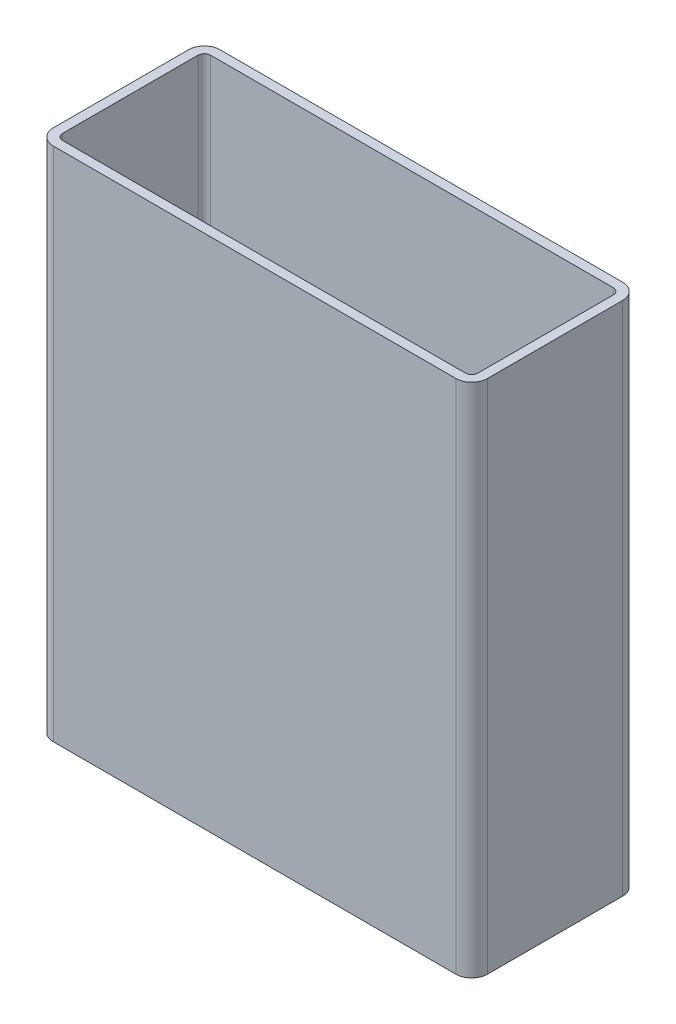
ISO-10303-21;
HEADER;
FILE_DESCRIPTION(('STEP AP214'),'2;1');
FILE_NAME('part.step','',(''),(''),'','','');
FILE_SCHEMA(('AUTOMOTIVE_DESIGN { 1 0 10303 214 1 1 1 1 }'));
ENDSEC;
DATA;
#1=APPLICATION_CONTEXT('core data for automotive mechanical design processes');
#2=APPLICATION_PROTOCOL_DEFINITION('international standard','automotive_design',2000,#1);
#3=PRODUCT_CONTEXT('',#1,'mechanical');
#4=PRODUCT('Part','Part','',(#3));
#5=PRODUCT_RELATED_PRODUCT_CATEGORY('part','',(#4));
#6=PRODUCT_DEFINITION_FORMATION('','',#4);
#7=PRODUCT_DEFINITION_CONTEXT('part definition',#1,'design');
#8=PRODUCT_DEFINITION('design','',#6,#7);
#9=PRODUCT_DEFINITION_SHAPE('','',#8);
#10=(LENGTH_UNIT() NAMED_UNIT(*) SI_UNIT(.MILLI.,.METRE.));
#11=(NAMED_UNIT(*) PLANE_ANGLE_UNIT() SI_UNIT($,.RADIAN.));
#12=(NAMED_UNIT(*) SI_UNIT($,.STERADIAN.) SOLID_ANGLE_UNIT());
#13=UNCERTAINTY_MEASURE_WITH_UNIT(LENGTH_MEASURE(1.E-05),#10,'distance_accuracy_value','');
#14=(GEOMETRIC_REPRESENTATION_CONTEXT(3) GLOBAL_UNCERTAINTY_ASSIGNED_CONTEXT((#13)) GLOBAL_UNIT_ASSIGNED_CONTEXT((#10,
#11,#12)) REPRESENTATION_CONTEXT('',''));
#15=CARTESIAN_POINT('',(0.,0.,0.));
#16=DIRECTION('',(0.,0.,1.));
#17=DIRECTION('',(1.,0.,0.));
#18=AXIS2_PLACEMENT_3D('',#15,#16,#17);
#19=CARTESIAN_POINT('',(6.4,16.4,2.15));
#20=DIRECTION('',(0.,-1.,0.));
#21=DIRECTION('',(0.,0.,-1.));
#22=AXIS2_PLACEMENT_3D('',#19,#20,#21);
#23=CYLINDRICAL_SURFACE('',#22,0.5);
#24=CARTESIAN_POINT('',(6.4,0.,2.15));
#25=DIRECTION('',(0.,1.,0.));
#26=DIRECTION('',(0.,0.,1.));
#27=AXIS2_PLACEMENT_3D('',#24,#25,#26);
#28=CIRCLE('',#27,0.5);
#29=CARTESIAN_POINT('',(6.4,0.,2.65));
#30=VERTEX_POINT('',#29);
#31=CARTESIAN_POINT('',(6.9,0.,2.15));
#32=VERTEX_POINT('',#31);
#33=EDGE_CURVE('E143',#30,#32,#28,.T.);
#34=ORIENTED_EDGE('',*,*,#33,.T.);
#35=DIRECTION('',(0.,-1.,0.));
#36=VECTOR('',#35,1.);
#37=CARTESIAN_POINT('',(6.9,16.4,2.15));
#38=LINE('',#37,#36);
#39=CARTESIAN_POINT('',(6.9,16.4,2.15));
#40=VERTEX_POINT('',#39);
#41=EDGE_CURVE('E11',#40,#32,#38,.T.);
#42=ORIENTED_EDGE('',*,*,#41,.F.);
#43=CARTESIAN_POINT('',(6.4,16.4,2.15));
#44=DIRECTION('',(0.,1.,0.));
#45=DIRECTION('',(0.,0.,1.));
#46=AXIS2_PLACEMENT_3D('',#43,#44,#45);
#47=CIRCLE('',#46,0.5);
#48=CARTESIAN_POINT('',(6.4,16.4,2.65));
#49=VERTEX_POINT('',#48);
#50=EDGE_CURVE('E159',#49,#40,#47,.T.);
#51=ORIENTED_EDGE('',*,*,#50,.F.);
#52=DIRECTION('',(0.,-1.,0.));
#53=VECTOR('',#52,1.);
#54=CARTESIAN_POINT('',(6.4,16.4,2.65));
#55=LINE('',#54,#53);
#56=EDGE_CURVE('E139',#49,#30,#55,.T.);
#57=ORIENTED_EDGE('',*,*,#56,.T.);
#58=EDGE_LOOP('',(#34,#42,#51,#57));
#59=FACE_BOUND('',#58,.T.);
#60=ADVANCED_FACE('F35',(#59),#23,.T.);
#61=CARTESIAN_POINT('',(6.9,16.4,2.15));
#62=DIRECTION('',(-1.,0.,0.));
#63=DIRECTION('',(0.,0.,1.));
#64=AXIS2_PLACEMENT_3D('',#61,#62,#63);
#65=PLANE('',#64);
#66=DIRECTION('',(0.,0.,-1.));
#67=VECTOR('',#66,1.);
#68=CARTESIAN_POINT('',(6.9,0.,2.15));
#69=LINE('',#68,#67);
#70=CARTESIAN_POINT('',(6.9,0.,-2.15));
#71=VERTEX_POINT('',#70);
#72=EDGE_CURVE('E146',#32,#71,#69,.T.);
#73=ORIENTED_EDGE('',*,*,#72,.T.);
#74=DIRECTION('',(0.,-1.,0.));
#75=VECTOR('',#74,1.);
#76=CARTESIAN_POINT('',(6.9,16.4,-2.15));
#77=LINE('',#76,#75);
#78=CARTESIAN_POINT('',(6.9,16.4,-2.15));
#79=VERTEX_POINT('',#78);
#80=EDGE_CURVE('E42',#79,#71,#77,.T.);
#81=ORIENTED_EDGE('',*,*,#80,.F.);
#82=DIRECTION('',(0.,0.,-1.));
#83=VECTOR('',#82,1.);
#84=CARTESIAN_POINT('',(6.9,16.4,2.15));
#85=LINE('',#84,#83);
#86=EDGE_CURVE('E99',#40,#79,#85,.T.);
#87=ORIENTED_EDGE('',*,*,#86,.F.);
#88=ORIENTED_EDGE('',*,*,#41,.T.);
#89=EDGE_LOOP('',(#73,#81,#87,#88));
#90=FACE_BOUND('',#89,.T.);
#91=ADVANCED_FACE('F333',(#90),#65,.F.);
#92=CARTESIAN_POINT('',(6.4,16.4,-2.15));
#93=DIRECTION('',(0.,-1.,0.));
#94=DIRECTION('',(0.,0.,-1.));
#95=AXIS2_PLACEMENT_3D('',#92,#93,#94);
#96=CYLINDRICAL_SURFACE('',#95,0.5);
#97=CARTESIAN_POINT('',(6.4,0.,-2.15));
#98=DIRECTION('',(0.,1.,0.));
#99=DIRECTION('',(0.,0.,-1.));
#100=AXIS2_PLACEMENT_3D('',#97,#98,#99);
#101=CIRCLE('',#100,0.5);
#102=CARTESIAN_POINT('',(6.4,0.,-2.65));
#103=VERTEX_POINT('',#102);
#104=EDGE_CURVE('E149',#71,#103,#101,.T.);
#105=ORIENTED_EDGE('',*,*,#104,.T.);
#106=DIRECTION('',(0.,-1.,0.));
#107=VECTOR('',#106,1.);
#108=CARTESIAN_POINT('',(6.4,16.4,-2.65));
#109=LINE('',#108,#107);
#110=CARTESIAN_POINT('',(6.4,16.4,-2.65));
#111=VERTEX_POINT('',#110);
#112=EDGE_CURVE('E166',#111,#103,#109,.T.);
#113=ORIENTED_EDGE('',*,*,#112,.F.);
#114=CARTESIAN_POINT('',(6.4,16.4,-2.15));
#115=DIRECTION('',(0.,1.,0.));
#116=DIRECTION('',(0.,0.,-1.));
#117=AXIS2_PLACEMENT_3D('',#114,#115,#116);
#118=CIRCLE('',#117,0.5);
#119=EDGE_CURVE('E174',#79,#111,#118,.T.);
#120=ORIENTED_EDGE('',*,*,#119,.F.);
#121=ORIENTED_EDGE('',*,*,#80,.T.);
#122=EDGE_LOOP('',(#105,#113,#120,#121));
#123=FACE_BOUND('',#122,.T.);
#124=ADVANCED_FACE('F172',(#123),#96,.T.);
#125=CARTESIAN_POINT('',(-6.4,16.4,-2.65));
#126=DIRECTION('',(0.,0.,1.));
#127=DIRECTION('',(1.,0.,0.));
#128=AXIS2_PLACEMENT_3D('',#125,#126,#127);
#129=PLANE('',#128);
#130=DIRECTION('',(-1.,0.,0.));
#131=VECTOR('',#130,1.);
#132=CARTESIAN_POINT('',(-6.4,0.,-2.65));
#133=LINE('',#132,#131);
#134=CARTESIAN_POINT('',(-6.4,0.,-2.65));
#135=VERTEX_POINT('',#134);
#136=EDGE_CURVE('E151',#103,#135,#133,.T.);
#137=ORIENTED_EDGE('',*,*,#136,.T.);
#138=DIRECTION('',(0.,-1.,0.));
#139=VECTOR('',#138,1.);
#140=CARTESIAN_POINT('',(-6.4,16.4,-2.65));
#141=LINE('',#140,#139);
#142=CARTESIAN_POINT('',(-6.4,16.4,-2.65));
#143=VERTEX_POINT('',#142);
#144=EDGE_CURVE('E163',#143,#135,#141,.T.);
#145=ORIENTED_EDGE('',*,*,#144,.F.);
#146=DIRECTION('',(-1.,0.,0.));
#147=VECTOR('',#146,1.);
#148=CARTESIAN_POINT('',(-6.4,16.4,-2.65));
#149=LINE('',#148,#147);
#150=EDGE_CURVE('E186',#111,#143,#149,.T.);
#151=ORIENTED_EDGE('',*,*,#150,.F.);
#152=ORIENTED_EDGE('',*,*,#112,.T.);
#153=EDGE_LOOP('',(#137,#145,#151,#152));
#154=FACE_BOUND('',#153,.T.);
#155=ADVANCED_FACE('F182',(#154),#129,.F.);
#156=CARTESIAN_POINT('',(-6.4,16.4,-2.15));
#157=DIRECTION('',(0.,-1.,0.));
#158=DIRECTION('',(0.,0.,-1.));
#159=AXIS2_PLACEMENT_3D('',#156,#157,#158);
#160=CYLINDRICAL_SURFACE('',#159,0.5);
#161=CARTESIAN_POINT('',(-6.4,0.,-2.15));
#162=DIRECTION('',(0.,1.,0.));
#163=DIRECTION('',(0.,0.,-1.));
#164=AXIS2_PLACEMENT_3D('',#161,#162,#163);
#165=CIRCLE('',#164,0.5);
#166=CARTESIAN_POINT('',(-6.9,0.,-2.15));
#167=VERTEX_POINT('',#166);
#168=EDGE_CURVE('E153',#135,#167,#165,.T.);
#169=ORIENTED_EDGE('',*,*,#168,.T.);
#170=DIRECTION('',(0.,-1.,0.));
#171=VECTOR('',#170,1.);
#172=CARTESIAN_POINT('',(-6.9,16.4,-2.15));
#173=LINE('',#172,#171);
#174=CARTESIAN_POINT('',(-6.9,16.4,-2.15));
#175=VERTEX_POINT('',#174);
#176=EDGE_CURVE('E134',#175,#167,#173,.T.);
#177=ORIENTED_EDGE('',*,*,#176,.F.);
#178=CARTESIAN_POINT('',(-6.4,16.4,-2.15));
#179=DIRECTION('',(0.,1.,0.));
#180=DIRECTION('',(0.,0.,-1.));
#181=AXIS2_PLACEMENT_3D('',#178,#179,#180);
#182=CIRCLE('',#181,0.5);
#183=EDGE_CURVE('E122',#143,#175,#182,.T.);
#184=ORIENTED_EDGE('',*,*,#183,.F.);
#185=ORIENTED_EDGE('',*,*,#144,.T.);
#186=EDGE_LOOP('',(#169,#177,#184,#185));
#187=FACE_BOUND('',#186,.T.);
#188=ADVANCED_FACE('F185',(#187),#160,.T.);
#189=CARTESIAN_POINT('',(-6.9,16.4,2.15));
#190=DIRECTION('',(1.,0.,0.));
#191=DIRECTION('',(0.,0.,-1.));
#192=AXIS2_PLACEMENT_3D('',#189,#190,#191);
#193=PLANE('',#192);
#194=DIRECTION('',(0.,0.,1.));
#195=VECTOR('',#194,1.);
#196=CARTESIAN_POINT('',(-6.9,0.,2.15));
#197=LINE('',#196,#195);
#198=CARTESIAN_POINT('',(-6.9,0.,2.15));
#199=VERTEX_POINT('',#198);
#200=EDGE_CURVE('E131',#167,#199,#197,.T.);
#201=ORIENTED_EDGE('',*,*,#200,.T.);
#202=DIRECTION('',(0.,-1.,0.));
#203=VECTOR('',#202,1.);
#204=CARTESIAN_POINT('',(-6.9,16.4,2.15));
#205=LINE('',#204,#203);
#206=CARTESIAN_POINT('',(-6.9,16.4,2.15));
#207=VERTEX_POINT('',#206);
#208=EDGE_CURVE('E128',#207,#199,#205,.T.);
#209=ORIENTED_EDGE('',*,*,#208,.F.);
#210=DIRECTION('',(0.,0.,1.));
#211=VECTOR('',#210,1.);
#212=CARTESIAN_POINT('',(-6.9,16.4,2.15));
#213=LINE('',#212,#211);
#214=EDGE_CURVE('E115',#175,#207,#213,.T.);
#215=ORIENTED_EDGE('',*,*,#214,.F.);
#216=ORIENTED_EDGE('',*,*,#176,.T.);
#217=EDGE_LOOP('',(#201,#209,#215,#216));
#218=FACE_BOUND('',#217,.T.);
#219=ADVANCED_FACE('F129',(#218),#193,.F.);
#220=CARTESIAN_POINT('',(-6.4,16.4,2.15));
#221=DIRECTION('',(0.,-1.,0.));
#222=DIRECTION('',(0.,0.,-1.));
#223=AXIS2_PLACEMENT_3D('',#220,#221,#222);
#224=CYLINDRICAL_SURFACE('',#223,0.5);
#225=CARTESIAN_POINT('',(-6.4,0.,2.15));
#226=DIRECTION('',(0.,1.,0.));
#227=DIRECTION('',(0.,0.,-1.));
#228=AXIS2_PLACEMENT_3D('',#225,#226,#227);
#229=CIRCLE('',#228,0.5);
#230=CARTESIAN_POINT('',(-6.4,0.,2.65));
#231=VERTEX_POINT('',#230);
#232=EDGE_CURVE('E156',#199,#231,#229,.T.);
#233=ORIENTED_EDGE('',*,*,#232,.T.);
#234=DIRECTION('',(0.,-1.,0.));
#235=VECTOR('',#234,1.);
#236=CARTESIAN_POINT('',(-6.4,16.4,2.65));
#237=LINE('',#236,#235);
#238=CARTESIAN_POINT('',(-6.4,16.4,2.65));
#239=VERTEX_POINT('',#238);
#240=EDGE_CURVE('E135',#239,#231,#237,.T.);
#241=ORIENTED_EDGE('',*,*,#240,.F.);
#242=CARTESIAN_POINT('',(-6.4,16.4,2.15));
#243=DIRECTION('',(0.,1.,0.));
#244=DIRECTION('',(0.,0.,-1.));
#245=AXIS2_PLACEMENT_3D('',#242,#243,#244);
#246=CIRCLE('',#245,0.5);
#247=EDGE_CURVE('E119',#207,#239,#246,.T.);
#248=ORIENTED_EDGE('',*,*,#247,.F.);
#249=ORIENTED_EDGE('',*,*,#208,.T.);
#250=EDGE_LOOP('',(#233,#241,#248,#249));
#251=FACE_BOUND('',#250,.T.);
#252=ADVANCED_FACE('F137',(#251),#224,.T.);
#253=CARTESIAN_POINT('',(-6.4,16.4,2.65));
#254=DIRECTION('',(0.,0.,-1.));
#255=DIRECTION('',(-1.,0.,0.));
#256=AXIS2_PLACEMENT_3D('',#253,#254,#255);
#257=PLANE('',#256);
#258=DIRECTION('',(1.,0.,0.));
#259=VECTOR('',#258,1.);
#260=CARTESIAN_POINT('',(-6.4,0.,2.65));
#261=LINE('',#260,#259);
#262=EDGE_CURVE('E91',#231,#30,#261,.T.);
#263=ORIENTED_EDGE('',*,*,#262,.T.);
#264=ORIENTED_EDGE('',*,*,#56,.F.);
#265=DIRECTION('',(1.,0.,0.));
#266=VECTOR('',#265,1.);
#267=CARTESIAN_POINT('',(-6.4,16.4,2.65));
#268=LINE('',#267,#266);
#269=EDGE_CURVE('E58',#239,#49,#268,.T.);
#270=ORIENTED_EDGE('',*,*,#269,.F.);
#271=ORIENTED_EDGE('',*,*,#240,.T.);
#272=EDGE_LOOP('',(#263,#264,#270,#271));
#273=FACE_BOUND('',#272,.T.);
#274=ADVANCED_FACE('F340',(#273),#257,.F.);
#275=CARTESIAN_POINT('',(6.4,16.4,2.15));
#276=DIRECTION('',(0.,1.,0.));
#277=DIRECTION('',(0.,0.,1.));
#278=AXIS2_PLACEMENT_3D('',#275,#276,#277);
#279=PLANE('',#278);
#280=CARTESIAN_POINT('',(6.4,16.4,-2.15));
#281=DIRECTION('',(0.,1.,0.));
#282=DIRECTION('',(0.,0.,1.));
#283=AXIS2_PLACEMENT_3D('',#280,#281,#282);
#284=CIRCLE('',#283,0.2);
#285=CARTESIAN_POINT('',(6.6,16.4,-2.15));
#286=VERTEX_POINT('',#285);
#287=CARTESIAN_POINT('',(6.4,16.4,-2.35));
#288=VERTEX_POINT('',#287);
#289=EDGE_CURVE('E49',#286,#288,#284,.T.);
#290=ORIENTED_EDGE('',*,*,#289,.F.);
#291=DIRECTION('',(0.,0.,-1.));
#292=VECTOR('',#291,1.);
#293=CARTESIAN_POINT('',(6.6,16.4,2.15));
#294=LINE('',#293,#292);
#295=CARTESIAN_POINT('',(6.6,16.4,2.15));
#296=VERTEX_POINT('',#295);
#297=EDGE_CURVE('E214',#296,#286,#294,.T.);
#298=ORIENTED_EDGE('',*,*,#297,.F.);
#299=CARTESIAN_POINT('',(6.4,16.4,2.15));
#300=DIRECTION('',(0.,1.,0.));
#301=DIRECTION('',(0.,0.,1.));
#302=AXIS2_PLACEMENT_3D('',#299,#300,#301);
#303=CIRCLE('',#302,0.2);
#304=CARTESIAN_POINT('',(6.4,16.4,2.35));
#305=VERTEX_POINT('',#304);
#306=EDGE_CURVE('E218',#305,#296,#303,.T.);
#307=ORIENTED_EDGE('',*,*,#306,.F.);
#308=DIRECTION('',(1.,0.,0.));
#309=VECTOR('',#308,1.);
#310=CARTESIAN_POINT('',(-6.4,16.4,2.35));
#311=LINE('',#310,#309);
#312=CARTESIAN_POINT('',(-6.4,16.4,2.35));
#313=VERTEX_POINT('',#312);
#314=EDGE_CURVE('E221',#313,#305,#311,.T.);
#315=ORIENTED_EDGE('',*,*,#314,.F.);
#316=CARTESIAN_POINT('',(-6.4,16.4,2.15));
#317=DIRECTION('',(0.,1.,0.));
#318=DIRECTION('',(0.,0.,1.));
#319=AXIS2_PLACEMENT_3D('',#316,#317,#318);
#320=CIRCLE('',#319,0.2);
#321=CARTESIAN_POINT('',(-6.6,16.4,2.15));
#322=VERTEX_POINT('',#321);
#323=EDGE_CURVE('E224',#322,#313,#320,.T.);
#324=ORIENTED_EDGE('',*,*,#323,.F.);
#325=DIRECTION('',(0.,0.,1.));
#326=VECTOR('',#325,1.);
#327=CARTESIAN_POINT('',(-6.6,16.4,-2.15));
#328=LINE('',#327,#326);
#329=CARTESIAN_POINT('',(-6.6,16.4,-2.15));
#330=VERTEX_POINT('',#329);
#331=EDGE_CURVE('E227',#330,#322,#328,.T.);
#332=ORIENTED_EDGE('',*,*,#331,.F.);
#333=CARTESIAN_POINT('',(-6.4,16.4,-2.15));
#334=DIRECTION('',(0.,1.,0.));
#335=DIRECTION('',(0.,0.,1.));
#336=AXIS2_PLACEMENT_3D('',#333,#334,#335);
#337=CIRCLE('',#336,0.2);
#338=CARTESIAN_POINT('',(-6.4,16.4,-2.35));
#339=VERTEX_POINT('',#338);
#340=EDGE_CURVE('E230',#339,#330,#337,.T.);
#341=ORIENTED_EDGE('',*,*,#340,.F.);
#342=DIRECTION('',(-1.,0.,0.));
#343=VECTOR('',#342,1.);
#344=CARTESIAN_POINT('',(6.4,16.4,-2.35));
#345=LINE('',#344,#343);
#346=EDGE_CURVE('E233',#288,#339,#345,.T.);
#347=ORIENTED_EDGE('',*,*,#346,.F.);
#348=EDGE_LOOP('',(#290,#298,#307,#315,#324,#332,#341,#347));
#349=FACE_BOUND('',#348,.T.);
#350=ORIENTED_EDGE('',*,*,#50,.T.);
#351=ORIENTED_EDGE('',*,*,#86,.T.);
#352=ORIENTED_EDGE('',*,*,#119,.T.);
#353=ORIENTED_EDGE('',*,*,#150,.T.);
#354=ORIENTED_EDGE('',*,*,#183,.T.);
#355=ORIENTED_EDGE('',*,*,#214,.T.);
#356=ORIENTED_EDGE('',*,*,#247,.T.);
#357=ORIENTED_EDGE('',*,*,#269,.T.);
#358=EDGE_LOOP('',(#350,#351,#352,#353,#354,#355,#356,#357));
#359=FACE_BOUND('',#358,.T.);
#360=ADVANCED_FACE('F117',(#349,#359),#279,.T.);
#361=CARTESIAN_POINT('',(6.4,0.,2.15));
#362=DIRECTION('',(0.,1.,0.));
#363=DIRECTION('',(0.,0.,1.));
#364=AXIS2_PLACEMENT_3D('',#361,#362,#363);
#365=PLANE('',#364);
#366=ORIENTED_EDGE('',*,*,#33,.F.);
#367=ORIENTED_EDGE('',*,*,#262,.F.);
#368=ORIENTED_EDGE('',*,*,#232,.F.);
#369=ORIENTED_EDGE('',*,*,#200,.F.);
#370=ORIENTED_EDGE('',*,*,#168,.F.);
#371=ORIENTED_EDGE('',*,*,#136,.F.);
#372=ORIENTED_EDGE('',*,*,#104,.F.);
#373=ORIENTED_EDGE('',*,*,#72,.F.);
#374=EDGE_LOOP('',(#366,#367,#368,#369,#370,#371,#372,#373));
#375=FACE_BOUND('',#374,.T.);
#376=ADVANCED_FACE('F178',(#375),#365,.F.);
#377=CARTESIAN_POINT('',(6.4,1.9,-2.15));
#378=DIRECTION('',(0.,1.,0.));
#379=DIRECTION('',(0.,0.,1.));
#380=AXIS2_PLACEMENT_3D('',#377,#378,#379);
#381=CYLINDRICAL_SURFACE('',#380,0.2);
#382=ORIENTED_EDGE('',*,*,#289,.T.);
#383=DIRECTION('',(0.,1.,0.));
#384=VECTOR('',#383,1.);
#385=CARTESIAN_POINT('',(6.4,1.9,-2.35));
#386=LINE('',#385,#384);
#387=CARTESIAN_POINT('',(6.4,1.9,-2.35));
#388=VERTEX_POINT('',#387);
#389=EDGE_CURVE('E192',#388,#288,#386,.T.);
#390=ORIENTED_EDGE('',*,*,#389,.F.);
#391=CARTESIAN_POINT('',(6.4,1.9,-2.15));
#392=DIRECTION('',(0.,1.,0.));
#393=DIRECTION('',(0.,0.,1.));
#394=AXIS2_PLACEMENT_3D('',#391,#392,#393);
#395=CIRCLE('',#394,0.2);
#396=CARTESIAN_POINT('',(6.6,1.9,-2.15));
#397=VERTEX_POINT('',#396);
#398=EDGE_CURVE('E217',#397,#388,#395,.T.);
#399=ORIENTED_EDGE('',*,*,#398,.F.);
#400=DIRECTION('',(0.,1.,0.));
#401=VECTOR('',#400,1.);
#402=CARTESIAN_POINT('',(6.6,1.9,-2.15));
#403=LINE('',#402,#401);
#404=EDGE_CURVE('E147',#397,#286,#403,.T.);
#405=ORIENTED_EDGE('',*,*,#404,.T.);
#406=EDGE_LOOP('',(#382,#390,#399,#405));
#407=FACE_BOUND('',#406,.T.);
#408=ADVANCED_FACE('F266',(#407),#381,.F.);
#409=CARTESIAN_POINT('',(6.6,1.9,2.15));
#410=DIRECTION('',(1.,0.,0.));
#411=DIRECTION('',(0.,0.,-1.));
#412=AXIS2_PLACEMENT_3D('',#409,#410,#411);
#413=PLANE('',#412);
#414=ORIENTED_EDGE('',*,*,#297,.T.);
#415=ORIENTED_EDGE('',*,*,#404,.F.);
#416=DIRECTION('',(0.,0.,-1.));
#417=VECTOR('',#416,1.);
#418=CARTESIAN_POINT('',(6.6,1.9,2.15));
#419=LINE('',#418,#417);
#420=CARTESIAN_POINT('',(6.6,1.9,2.15));
#421=VERTEX_POINT('',#420);
#422=EDGE_CURVE('E195',#421,#397,#419,.T.);
#423=ORIENTED_EDGE('',*,*,#422,.F.);
#424=DIRECTION('',(0.,1.,0.));
#425=VECTOR('',#424,1.);
#426=CARTESIAN_POINT('',(6.6,1.9,2.15));
#427=LINE('',#426,#425);
#428=EDGE_CURVE('E210',#421,#296,#427,.T.);
#429=ORIENTED_EDGE('',*,*,#428,.T.);
#430=EDGE_LOOP('',(#414,#415,#423,#429));
#431=FACE_BOUND('',#430,.T.);
#432=ADVANCED_FACE('F286',(#431),#413,.F.);
#433=CARTESIAN_POINT('',(6.4,1.9,2.15));
#434=DIRECTION('',(0.,1.,0.));
#435=DIRECTION('',(0.,0.,1.));
#436=AXIS2_PLACEMENT_3D('',#433,#434,#435);
#437=CYLINDRICAL_SURFACE('',#436,0.2);
#438=ORIENTED_EDGE('',*,*,#306,.T.);
#439=ORIENTED_EDGE('',*,*,#428,.F.);
#440=CARTESIAN_POINT('',(6.4,1.9,2.15));
#441=DIRECTION('',(0.,1.,0.));
#442=DIRECTION('',(0.,0.,1.));
#443=AXIS2_PLACEMENT_3D('',#440,#441,#442);
#444=CIRCLE('',#443,0.2);
#445=CARTESIAN_POINT('',(6.4,1.9,2.35));
#446=VERTEX_POINT('',#445);
#447=EDGE_CURVE('E239',#446,#421,#444,.T.);
#448=ORIENTED_EDGE('',*,*,#447,.F.);
#449=DIRECTION('',(0.,1.,0.));
#450=VECTOR('',#449,1.);
#451=CARTESIAN_POINT('',(6.4,1.9,2.35));
#452=LINE('',#451,#450);
#453=EDGE_CURVE('E207',#446,#305,#452,.T.);
#454=ORIENTED_EDGE('',*,*,#453,.T.);
#455=EDGE_LOOP('',(#438,#439,#448,#454));
#456=FACE_BOUND('',#455,.T.);
#457=ADVANCED_FACE('F291',(#456),#437,.F.);
#458=CARTESIAN_POINT('',(-6.4,1.9,2.35));
#459=DIRECTION('',(0.,0.,1.));
#460=DIRECTION('',(1.,0.,0.));
#461=AXIS2_PLACEMENT_3D('',#458,#459,#460);
#462=PLANE('',#461);
#463=ORIENTED_EDGE('',*,*,#314,.T.);
#464=ORIENTED_EDGE('',*,*,#453,.F.);
#465=DIRECTION('',(1.,0.,0.));
#466=VECTOR('',#465,1.);
#467=CARTESIAN_POINT('',(-6.4,1.9,2.35));
#468=LINE('',#467,#466);
#469=CARTESIAN_POINT('',(-6.4,1.9,2.35));
#470=VERTEX_POINT('',#469);
#471=EDGE_CURVE('E242',#470,#446,#468,.T.);
#472=ORIENTED_EDGE('',*,*,#471,.F.);
#473=DIRECTION('',(0.,1.,0.));
#474=VECTOR('',#473,1.);
#475=CARTESIAN_POINT('',(-6.4,1.9,2.35));
#476=LINE('',#475,#474);
#477=EDGE_CURVE('E204',#470,#313,#476,.T.);
#478=ORIENTED_EDGE('',*,*,#477,.T.);
#479=EDGE_LOOP('',(#463,#464,#472,#478));
#480=FACE_BOUND('',#479,.T.);
#481=ADVANCED_FACE('F317',(#480),#462,.F.);
#482=CARTESIAN_POINT('',(-6.4,1.9,2.15));
#483=DIRECTION('',(0.,1.,0.));
#484=DIRECTION('',(0.,0.,1.));
#485=AXIS2_PLACEMENT_3D('',#482,#483,#484);
#486=CYLINDRICAL_SURFACE('',#485,0.2);
#487=ORIENTED_EDGE('',*,*,#323,.T.);
#488=ORIENTED_EDGE('',*,*,#477,.F.);
#489=CARTESIAN_POINT('',(-6.4,1.9,2.15));
#490=DIRECTION('',(0.,1.,0.));
#491=DIRECTION('',(0.,0.,1.));
#492=AXIS2_PLACEMENT_3D('',#489,#490,#491);
#493=CIRCLE('',#492,0.2);
#494=CARTESIAN_POINT('',(-6.6,1.9,2.15));
#495=VERTEX_POINT('',#494);
#496=EDGE_CURVE('E245',#495,#470,#493,.T.);
#497=ORIENTED_EDGE('',*,*,#496,.F.);
#498=DIRECTION('',(0.,1.,0.));
#499=VECTOR('',#498,1.);
#500=CARTESIAN_POINT('',(-6.6,1.9,2.15));
#501=LINE('',#500,#499);
#502=EDGE_CURVE('E201',#495,#322,#501,.T.);
#503=ORIENTED_EDGE('',*,*,#502,.T.);
#504=EDGE_LOOP('',(#487,#488,#497,#503));
#505=FACE_BOUND('',#504,.T.);
#506=ADVANCED_FACE('F320',(#505),#486,.F.);
#507=CARTESIAN_POINT('',(-6.6,1.9,-2.15));
#508=DIRECTION('',(-1.,0.,0.));
#509=DIRECTION('',(0.,0.,1.));
#510=AXIS2_PLACEMENT_3D('',#507,#508,#509);
#511=PLANE('',#510);
#512=ORIENTED_EDGE('',*,*,#331,.T.);
#513=ORIENTED_EDGE('',*,*,#502,.F.);
#514=DIRECTION('',(0.,0.,1.));
#515=VECTOR('',#514,1.);
#516=CARTESIAN_POINT('',(-6.6,1.9,-2.15));
#517=LINE('',#516,#515);
#518=CARTESIAN_POINT('',(-6.6,1.9,-2.15));
#519=VERTEX_POINT('',#518);
#520=EDGE_CURVE('E248',#519,#495,#517,.T.);
#521=ORIENTED_EDGE('',*,*,#520,.F.);
#522=DIRECTION('',(0.,1.,0.));
#523=VECTOR('',#522,1.);
#524=CARTESIAN_POINT('',(-6.6,1.9,-2.15));
#525=LINE('',#524,#523);
#526=EDGE_CURVE('E198',#519,#330,#525,.T.);
#527=ORIENTED_EDGE('',*,*,#526,.T.);
#528=EDGE_LOOP('',(#512,#513,#521,#527));
#529=FACE_BOUND('',#528,.T.);
#530=ADVANCED_FACE('F323',(#529),#511,.F.);
#531=CARTESIAN_POINT('',(-6.4,1.9,-2.15));
#532=DIRECTION('',(0.,1.,0.));
#533=DIRECTION('',(0.,0.,1.));
#534=AXIS2_PLACEMENT_3D('',#531,#532,#533);
#535=CYLINDRICAL_SURFACE('',#534,0.2);
#536=ORIENTED_EDGE('',*,*,#340,.T.);
#537=ORIENTED_EDGE('',*,*,#526,.F.);
#538=CARTESIAN_POINT('',(-6.4,1.9,-2.15));
#539=DIRECTION('',(0.,1.,0.));
#540=DIRECTION('',(0.,0.,1.));
#541=AXIS2_PLACEMENT_3D('',#538,#539,#540);
#542=CIRCLE('',#541,0.2);
#543=CARTESIAN_POINT('',(-6.4,1.9,-2.35));
#544=VERTEX_POINT('',#543);
#545=EDGE_CURVE('E251',#544,#519,#542,.T.);
#546=ORIENTED_EDGE('',*,*,#545,.F.);
#547=DIRECTION('',(0.,1.,0.));
#548=VECTOR('',#547,1.);
#549=CARTESIAN_POINT('',(-6.4,1.9,-2.35));
#550=LINE('',#549,#548);
#551=EDGE_CURVE('E194',#544,#339,#550,.T.);
#552=ORIENTED_EDGE('',*,*,#551,.T.);
#553=EDGE_LOOP('',(#536,#537,#546,#552));
#554=FACE_BOUND('',#553,.T.);
#555=ADVANCED_FACE('F306',(#554),#535,.F.);
#556=CARTESIAN_POINT('',(6.4,1.9,-2.35));
#557=DIRECTION('',(0.,0.,-1.));
#558=DIRECTION('',(-1.,0.,0.));
#559=AXIS2_PLACEMENT_3D('',#556,#557,#558);
#560=PLANE('',#559);
#561=ORIENTED_EDGE('',*,*,#346,.T.);
#562=ORIENTED_EDGE('',*,*,#551,.F.);
#563=DIRECTION('',(-1.,0.,0.));
#564=VECTOR('',#563,1.);
#565=CARTESIAN_POINT('',(6.4,1.9,-2.35));
#566=LINE('',#565,#564);
#567=EDGE_CURVE('E254',#388,#544,#566,.T.);
#568=ORIENTED_EDGE('',*,*,#567,.F.);
#569=ORIENTED_EDGE('',*,*,#389,.T.);
#570=EDGE_LOOP('',(#561,#562,#568,#569));
#571=FACE_BOUND('',#570,.T.);
#572=ADVANCED_FACE('F300',(#571),#560,.F.);
#573=CARTESIAN_POINT('',(6.4,1.9,-2.15));
#574=DIRECTION('',(0.,1.,0.));
#575=DIRECTION('',(0.,0.,1.));
#576=AXIS2_PLACEMENT_3D('',#573,#574,#575);
#577=PLANE('',#576);
#578=ORIENTED_EDGE('',*,*,#398,.T.);
#579=ORIENTED_EDGE('',*,*,#567,.T.);
#580=ORIENTED_EDGE('',*,*,#545,.T.);
#581=ORIENTED_EDGE('',*,*,#520,.T.);
#582=ORIENTED_EDGE('',*,*,#496,.T.);
#583=ORIENTED_EDGE('',*,*,#471,.T.);
#584=ORIENTED_EDGE('',*,*,#447,.T.);
#585=ORIENTED_EDGE('',*,*,#422,.T.);
#586=EDGE_LOOP('',(#578,#579,#580,#581,#582,#583,#584,#585));
#587=FACE_BOUND('',#586,.T.);
#588=ADVANCED_FACE('F261',(#587),#577,.T.);
#589=CLOSED_SHELL('',(#60,#91,#124,#155,#188,#219,#252,#274,#360,#376,#408,#432,#457,#481,#506,
#530,#555,#572,#588));
#590=MANIFOLD_SOLID_BREP('B2',#589);
#591=ADVANCED_BREP_SHAPE_REPRESENTATION('',(#18,#590),#14);
#592=SHAPE_DEFINITION_REPRESENTATION(#9,#591);
ENDSEC;
END-ISO-10303-21;
